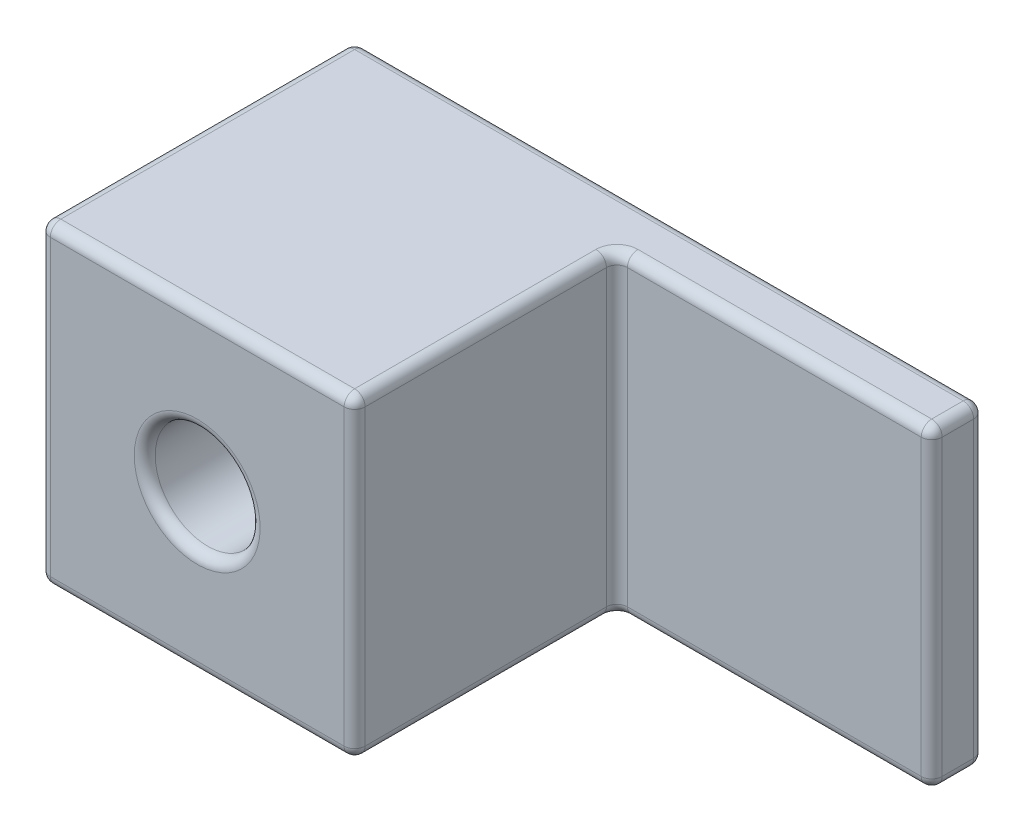
ISO-10303-21;
HEADER;
FILE_DESCRIPTION(('STEP AP214'),'2;1');
FILE_NAME('part.step','',(''),(''),'','','');
FILE_SCHEMA(('AUTOMOTIVE_DESIGN { 1 0 10303 214 1 1 1 1 }'));
ENDSEC;
DATA;
#1=APPLICATION_CONTEXT('core data for automotive mechanical design processes');
#2=APPLICATION_PROTOCOL_DEFINITION('international standard','automotive_design',2000,#1);
#3=PRODUCT_CONTEXT('',#1,'mechanical');
#4=PRODUCT('Part','Part','',(#3));
#5=PRODUCT_RELATED_PRODUCT_CATEGORY('part','',(#4));
#6=PRODUCT_DEFINITION_FORMATION('','',#4);
#7=PRODUCT_DEFINITION_CONTEXT('part definition',#1,'design');
#8=PRODUCT_DEFINITION('design','',#6,#7);
#9=PRODUCT_DEFINITION_SHAPE('','',#8);
#10=(LENGTH_UNIT() NAMED_UNIT(*) SI_UNIT(.MILLI.,.METRE.));
#11=(NAMED_UNIT(*) PLANE_ANGLE_UNIT() SI_UNIT($,.RADIAN.));
#12=(NAMED_UNIT(*) SI_UNIT($,.STERADIAN.) SOLID_ANGLE_UNIT());
#13=UNCERTAINTY_MEASURE_WITH_UNIT(LENGTH_MEASURE(1.E-05),#10,'distance_accuracy_value','');
#14=(GEOMETRIC_REPRESENTATION_CONTEXT(3) GLOBAL_UNCERTAINTY_ASSIGNED_CONTEXT((#13)) GLOBAL_UNIT_ASSIGNED_CONTEXT((#10,
#11,#12)) REPRESENTATION_CONTEXT('',''));
#15=CARTESIAN_POINT('',(0.,0.,0.));
#16=DIRECTION('',(0.,0.,1.));
#17=DIRECTION('',(1.,0.,0.));
#18=AXIS2_PLACEMENT_3D('',#15,#16,#17);
#19=CARTESIAN_POINT('',(60.,0.,60.));
#20=DIRECTION('',(-1.,0.,0.));
#21=DIRECTION('',(0.,0.,1.));
#22=AXIS2_PLACEMENT_3D('',#19,#20,#21);
#23=PLANE('',#22);
#24=DIRECTION('',(0.,1.,0.));
#25=VECTOR('',#24,1.);
#26=CARTESIAN_POINT('',(60.,0.,58.));
#27=LINE('',#26,#25);
#28=CARTESIAN_POINT('',(60.,58.,58.));
#29=VERTEX_POINT('',#28);
#30=CARTESIAN_POINT('',(60.,2.,58.));
#31=VERTEX_POINT('',#30);
#32=EDGE_CURVE('E46',#29,#31,#27,.F.);
#33=ORIENTED_EDGE('',*,*,#32,.T.);
#34=DIRECTION('',(0.,0.,-1.));
#35=VECTOR('',#34,1.);
#36=CARTESIAN_POINT('',(60.,2.,60.));
#37=LINE('',#36,#35);
#38=CARTESIAN_POINT('',(60.,2.,12.));
#39=VERTEX_POINT('',#38);
#40=EDGE_CURVE('E11',#31,#39,#37,.T.);
#41=ORIENTED_EDGE('',*,*,#40,.T.);
#42=DIRECTION('',(0.,-1.,0.));
#43=VECTOR('',#42,1.);
#44=CARTESIAN_POINT('',(60.,60.,12.));
#45=LINE('',#44,#43);
#46=CARTESIAN_POINT('',(60.,58.,12.));
#47=VERTEX_POINT('',#46);
#48=EDGE_CURVE('E289',#39,#47,#45,.F.);
#49=ORIENTED_EDGE('',*,*,#48,.T.);
#50=DIRECTION('',(0.,0.,-1.));
#51=VECTOR('',#50,1.);
#52=CARTESIAN_POINT('',(60.,58.,60.));
#53=LINE('',#52,#51);
#54=EDGE_CURVE('E57',#47,#29,#53,.F.);
#55=ORIENTED_EDGE('',*,*,#54,.T.);
#56=EDGE_LOOP('',(#33,#41,#49,#55));
#57=FACE_BOUND('',#56,.T.);
#58=ADVANCED_FACE('F37',(#57),#23,.F.);
#59=CARTESIAN_POINT('',(0.,0.,60.));
#60=DIRECTION('',(0.,0.,-1.));
#61=DIRECTION('',(-1.,0.,0.));
#62=AXIS2_PLACEMENT_3D('',#59,#60,#61);
#63=PLANE('',#62);
#64=CARTESIAN_POINT('',(30.,30.,60.));
#65=DIRECTION('',(0.,0.,-1.));
#66=DIRECTION('',(-1.,0.,0.));
#67=AXIS2_PLACEMENT_3D('',#64,#65,#66);
#68=CIRCLE('',#67,12.);
#69=CARTESIAN_POINT('',(18.,30.,60.));
#70=VERTEX_POINT('',#69);
#71=EDGE_CURVE('E239',#70,#70,#68,.T.);
#72=ORIENTED_EDGE('',*,*,#71,.T.);
#73=EDGE_LOOP('',(#72));
#74=FACE_BOUND('',#73,.T.);
#75=DIRECTION('',(-1.,0.,0.));
#76=VECTOR('',#75,1.);
#77=CARTESIAN_POINT('',(0.,58.,60.));
#78=LINE('',#77,#76);
#79=CARTESIAN_POINT('',(58.,58.,60.));
#80=VERTEX_POINT('',#79);
#81=CARTESIAN_POINT('',(2.,58.,60.));
#82=VERTEX_POINT('',#81);
#83=EDGE_CURVE('E232',#80,#82,#78,.T.);
#84=ORIENTED_EDGE('',*,*,#83,.T.);
#85=DIRECTION('',(0.,-1.,0.));
#86=VECTOR('',#85,1.);
#87=CARTESIAN_POINT('',(2.,0.,60.));
#88=LINE('',#87,#86);
#89=CARTESIAN_POINT('',(2.,2.,60.));
#90=VERTEX_POINT('',#89);
#91=EDGE_CURVE('E236',#82,#90,#88,.T.);
#92=ORIENTED_EDGE('',*,*,#91,.T.);
#93=DIRECTION('',(1.,0.,0.));
#94=VECTOR('',#93,1.);
#95=CARTESIAN_POINT('',(0.,2.,60.));
#96=LINE('',#95,#94);
#97=CARTESIAN_POINT('',(58.,2.,60.));
#98=VERTEX_POINT('',#97);
#99=EDGE_CURVE('E234',#90,#98,#96,.T.);
#100=ORIENTED_EDGE('',*,*,#99,.T.);
#101=DIRECTION('',(0.,1.,0.));
#102=VECTOR('',#101,1.);
#103=CARTESIAN_POINT('',(58.,0.,60.));
#104=LINE('',#103,#102);
#105=EDGE_CURVE('E230',#98,#80,#104,.T.);
#106=ORIENTED_EDGE('',*,*,#105,.T.);
#107=EDGE_LOOP('',(#84,#92,#100,#106));
#108=FACE_BOUND('',#107,.T.);
#109=ADVANCED_FACE('F401',(#74,#108),#63,.F.);
#110=CARTESIAN_POINT('',(0.,0.,0.));
#111=DIRECTION('',(0.,0.,-1.));
#112=DIRECTION('',(-1.,0.,0.));
#113=AXIS2_PLACEMENT_3D('',#110,#111,#112);
#114=PLANE('',#113);
#115=DIRECTION('',(0.,1.,0.));
#116=VECTOR('',#115,1.);
#117=CARTESIAN_POINT('',(118.,0.,0.));
#118=LINE('',#117,#116);
#119=CARTESIAN_POINT('',(118.,58.,0.));
#120=VERTEX_POINT('',#119);
#121=CARTESIAN_POINT('',(118.,2.,0.));
#122=VERTEX_POINT('',#121);
#123=EDGE_CURVE('E186',#120,#122,#118,.F.);
#124=ORIENTED_EDGE('',*,*,#123,.T.);
#125=DIRECTION('',(1.,0.,0.));
#126=VECTOR('',#125,1.);
#127=CARTESIAN_POINT('',(0.,2.,0.));
#128=LINE('',#127,#126);
#129=CARTESIAN_POINT('',(2.,2.,0.));
#130=VERTEX_POINT('',#129);
#131=EDGE_CURVE('E228',#122,#130,#128,.F.);
#132=ORIENTED_EDGE('',*,*,#131,.T.);
#133=DIRECTION('',(0.,-1.,0.));
#134=VECTOR('',#133,1.);
#135=CARTESIAN_POINT('',(2.,60.,0.));
#136=LINE('',#135,#134);
#137=CARTESIAN_POINT('',(2.,58.,0.));
#138=VERTEX_POINT('',#137);
#139=EDGE_CURVE('E225',#130,#138,#136,.F.);
#140=ORIENTED_EDGE('',*,*,#139,.T.);
#141=DIRECTION('',(-1.,0.,0.));
#142=VECTOR('',#141,1.);
#143=CARTESIAN_POINT('',(120.,58.,0.));
#144=LINE('',#143,#142);
#145=EDGE_CURVE('E223',#138,#120,#144,.F.);
#146=ORIENTED_EDGE('',*,*,#145,.T.);
#147=EDGE_LOOP('',(#124,#132,#140,#146));
#148=FACE_BOUND('',#147,.T.);
#149=CARTESIAN_POINT('',(30.,30.,0.));
#150=DIRECTION('',(0.,0.,-1.));
#151=DIRECTION('',(-1.,0.,0.));
#152=AXIS2_PLACEMENT_3D('',#149,#150,#151);
#153=CIRCLE('',#152,12.);
#154=CARTESIAN_POINT('',(18.,30.,0.));
#155=VERTEX_POINT('',#154);
#156=EDGE_CURVE('E220',#155,#155,#153,.F.);
#157=ORIENTED_EDGE('',*,*,#156,.T.);
#158=EDGE_LOOP('',(#157));
#159=FACE_BOUND('',#158,.T.);
#160=ADVANCED_FACE('F480',(#148,#159),#114,.T.);
#161=CARTESIAN_POINT('',(0.,0.,60.));
#162=DIRECTION('',(1.,0.,0.));
#163=DIRECTION('',(0.,0.,-1.));
#164=AXIS2_PLACEMENT_3D('',#161,#162,#163);
#165=PLANE('',#164);
#166=DIRECTION('',(0.,-1.,0.));
#167=VECTOR('',#166,1.);
#168=CARTESIAN_POINT('',(0.,0.,2.));
#169=LINE('',#168,#167);
#170=CARTESIAN_POINT('',(0.,58.,2.));
#171=VERTEX_POINT('',#170);
#172=CARTESIAN_POINT('',(0.,2.,2.));
#173=VERTEX_POINT('',#172);
#174=EDGE_CURVE('E244',#171,#173,#169,.T.);
#175=ORIENTED_EDGE('',*,*,#174,.T.);
#176=DIRECTION('',(0.,0.,-1.));
#177=VECTOR('',#176,1.);
#178=CARTESIAN_POINT('',(0.,2.,60.));
#179=LINE('',#178,#177);
#180=CARTESIAN_POINT('',(0.,2.,58.));
#181=VERTEX_POINT('',#180);
#182=EDGE_CURVE('E249',#173,#181,#179,.F.);
#183=ORIENTED_EDGE('',*,*,#182,.T.);
#184=DIRECTION('',(0.,-1.,0.));
#185=VECTOR('',#184,1.);
#186=CARTESIAN_POINT('',(0.,0.,58.));
#187=LINE('',#186,#185);
#188=CARTESIAN_POINT('',(0.,58.,58.));
#189=VERTEX_POINT('',#188);
#190=EDGE_CURVE('E246',#181,#189,#187,.F.);
#191=ORIENTED_EDGE('',*,*,#190,.T.);
#192=DIRECTION('',(0.,0.,-1.));
#193=VECTOR('',#192,1.);
#194=CARTESIAN_POINT('',(0.,58.,60.));
#195=LINE('',#194,#193);
#196=EDGE_CURVE('E242',#189,#171,#195,.T.);
#197=ORIENTED_EDGE('',*,*,#196,.T.);
#198=EDGE_LOOP('',(#175,#183,#191,#197));
#199=FACE_BOUND('',#198,.T.);
#200=ADVANCED_FACE('F427',(#199),#165,.F.);
#201=CARTESIAN_POINT('',(0.,0.,60.));
#202=DIRECTION('',(0.,1.,0.));
#203=DIRECTION('',(0.,0.,1.));
#204=AXIS2_PLACEMENT_3D('',#201,#202,#203);
#205=PLANE('',#204);
#206=DIRECTION('',(1.,0.,0.));
#207=VECTOR('',#206,1.);
#208=CARTESIAN_POINT('',(120.,0.,2.));
#209=LINE('',#208,#207);
#210=CARTESIAN_POINT('',(2.,0.,2.));
#211=VERTEX_POINT('',#210);
#212=CARTESIAN_POINT('',(118.,0.,2.));
#213=VERTEX_POINT('',#212);
#214=EDGE_CURVE('E263',#211,#213,#209,.T.);
#215=ORIENTED_EDGE('',*,*,#214,.T.);
#216=DIRECTION('',(0.,0.,-1.));
#217=VECTOR('',#216,1.);
#218=CARTESIAN_POINT('',(118.,0.,10.));
#219=LINE('',#218,#217);
#220=CARTESIAN_POINT('',(118.,0.,8.));
#221=VERTEX_POINT('',#220);
#222=EDGE_CURVE('E265',#213,#221,#219,.F.);
#223=ORIENTED_EDGE('',*,*,#222,.T.);
#224=DIRECTION('',(-1.,0.,0.));
#225=VECTOR('',#224,1.);
#226=CARTESIAN_POINT('',(0.,0.,8.));
#227=LINE('',#226,#225);
#228=CARTESIAN_POINT('',(62.,0.,8.));
#229=VERTEX_POINT('',#228);
#230=EDGE_CURVE('E256',#221,#229,#227,.T.);
#231=ORIENTED_EDGE('',*,*,#230,.T.);
#232=CARTESIAN_POINT('',(62.,0.,12.));
#233=DIRECTION('',(0.,1.,0.));
#234=DIRECTION('',(0.,0.,1.));
#235=AXIS2_PLACEMENT_3D('',#232,#233,#234);
#236=CIRCLE('',#235,4.);
#237=CARTESIAN_POINT('',(58.,0.,12.));
#238=VERTEX_POINT('',#237);
#239=EDGE_CURVE('E253',#238,#229,#236,.F.);
#240=ORIENTED_EDGE('',*,*,#239,.F.);
#241=DIRECTION('',(0.,0.,-1.));
#242=VECTOR('',#241,1.);
#243=CARTESIAN_POINT('',(58.,0.,60.));
#244=LINE('',#243,#242);
#245=CARTESIAN_POINT('',(58.,0.,58.));
#246=VERTEX_POINT('',#245);
#247=EDGE_CURVE('E251',#238,#246,#244,.F.);
#248=ORIENTED_EDGE('',*,*,#247,.T.);
#249=DIRECTION('',(1.,0.,0.));
#250=VECTOR('',#249,1.);
#251=CARTESIAN_POINT('',(0.,0.,58.));
#252=LINE('',#251,#250);
#253=CARTESIAN_POINT('',(2.,0.,58.));
#254=VERTEX_POINT('',#253);
#255=EDGE_CURVE('E258',#246,#254,#252,.F.);
#256=ORIENTED_EDGE('',*,*,#255,.T.);
#257=DIRECTION('',(0.,0.,-1.));
#258=VECTOR('',#257,1.);
#259=CARTESIAN_POINT('',(2.,0.,60.));
#260=LINE('',#259,#258);
#261=EDGE_CURVE('E260',#254,#211,#260,.T.);
#262=ORIENTED_EDGE('',*,*,#261,.T.);
#263=EDGE_LOOP('',(#215,#223,#231,#240,#248,#256,#262));
#264=FACE_BOUND('',#263,.T.);
#265=ADVANCED_FACE('F392',(#264),#205,.F.);
#266=CARTESIAN_POINT('',(0.,60.,60.));
#267=DIRECTION('',(0.,-1.,0.));
#268=DIRECTION('',(0.,0.,-1.));
#269=AXIS2_PLACEMENT_3D('',#266,#267,#268);
#270=PLANE('',#269);
#271=DIRECTION('',(-1.,0.,0.));
#272=VECTOR('',#271,1.);
#273=CARTESIAN_POINT('',(0.,60.,2.));
#274=LINE('',#273,#272);
#275=CARTESIAN_POINT('',(118.,60.,2.));
#276=VERTEX_POINT('',#275);
#277=CARTESIAN_POINT('',(2.,60.,2.));
#278=VERTEX_POINT('',#277);
#279=EDGE_CURVE('E279',#276,#278,#274,.T.);
#280=ORIENTED_EDGE('',*,*,#279,.T.);
#281=DIRECTION('',(0.,0.,-1.));
#282=VECTOR('',#281,1.);
#283=CARTESIAN_POINT('',(2.,60.,60.));
#284=LINE('',#283,#282);
#285=CARTESIAN_POINT('',(2.,60.,58.));
#286=VERTEX_POINT('',#285);
#287=EDGE_CURVE('E281',#278,#286,#284,.F.);
#288=ORIENTED_EDGE('',*,*,#287,.T.);
#289=DIRECTION('',(-1.,0.,0.));
#290=VECTOR('',#289,1.);
#291=CARTESIAN_POINT('',(0.,60.,58.));
#292=LINE('',#291,#290);
#293=CARTESIAN_POINT('',(58.,60.,58.));
#294=VERTEX_POINT('',#293);
#295=EDGE_CURVE('E272',#286,#294,#292,.F.);
#296=ORIENTED_EDGE('',*,*,#295,.T.);
#297=DIRECTION('',(0.,0.,-1.));
#298=VECTOR('',#297,1.);
#299=CARTESIAN_POINT('',(58.,60.,60.));
#300=LINE('',#299,#298);
#301=CARTESIAN_POINT('',(58.,60.,12.));
#302=VERTEX_POINT('',#301);
#303=EDGE_CURVE('E270',#294,#302,#300,.T.);
#304=ORIENTED_EDGE('',*,*,#303,.T.);
#305=CARTESIAN_POINT('',(62.,60.,12.));
#306=DIRECTION('',(0.,-1.,0.));
#307=DIRECTION('',(0.,0.,-1.));
#308=AXIS2_PLACEMENT_3D('',#305,#306,#307);
#309=CIRCLE('',#308,4.);
#310=CARTESIAN_POINT('',(62.,60.,8.));
#311=VERTEX_POINT('',#310);
#312=EDGE_CURVE('E267',#311,#302,#309,.F.);
#313=ORIENTED_EDGE('',*,*,#312,.F.);
#314=DIRECTION('',(-1.,0.,0.));
#315=VECTOR('',#314,1.);
#316=CARTESIAN_POINT('',(0.,60.,8.));
#317=LINE('',#316,#315);
#318=CARTESIAN_POINT('',(118.,60.,8.));
#319=VERTEX_POINT('',#318);
#320=EDGE_CURVE('E274',#311,#319,#317,.F.);
#321=ORIENTED_EDGE('',*,*,#320,.T.);
#322=DIRECTION('',(0.,0.,1.));
#323=VECTOR('',#322,1.);
#324=CARTESIAN_POINT('',(118.,60.,0.));
#325=LINE('',#324,#323);
#326=EDGE_CURVE('E276',#319,#276,#325,.F.);
#327=ORIENTED_EDGE('',*,*,#326,.T.);
#328=EDGE_LOOP('',(#280,#288,#296,#304,#313,#321,#327));
#329=FACE_BOUND('',#328,.T.);
#330=ADVANCED_FACE('F485',(#329),#270,.F.);
#331=CARTESIAN_POINT('',(30.,30.,60.));
#332=DIRECTION('',(0.,0.,-1.));
#333=DIRECTION('',(-1.,0.,0.));
#334=AXIS2_PLACEMENT_3D('',#331,#332,#333);
#335=CYLINDRICAL_SURFACE('',#334,10.);
#336=CARTESIAN_POINT('',(30.,30.,2.));
#337=DIRECTION('',(0.,0.,-1.));
#338=DIRECTION('',(-1.,0.,0.));
#339=AXIS2_PLACEMENT_3D('',#336,#337,#338);
#340=CIRCLE('',#339,10.);
#341=CARTESIAN_POINT('',(20.,30.,2.));
#342=VERTEX_POINT('',#341);
#343=EDGE_CURVE('E286',#342,#342,#340,.T.);
#344=ORIENTED_EDGE('',*,*,#343,.T.);
#345=EDGE_LOOP('',(#344));
#346=FACE_BOUND('',#345,.T.);
#347=CARTESIAN_POINT('',(30.,30.,58.));
#348=DIRECTION('',(0.,0.,-1.));
#349=DIRECTION('',(-1.,0.,0.));
#350=AXIS2_PLACEMENT_3D('',#347,#348,#349);
#351=CIRCLE('',#350,10.);
#352=CARTESIAN_POINT('',(20.,30.,58.));
#353=VERTEX_POINT('',#352);
#354=EDGE_CURVE('E283',#353,#353,#351,.F.);
#355=ORIENTED_EDGE('',*,*,#354,.T.);
#356=EDGE_LOOP('',(#355));
#357=FACE_BOUND('',#356,.T.);
#358=ADVANCED_FACE('F579',(#346,#357),#335,.F.);
#359=CARTESIAN_POINT('',(120.,0.,10.));
#360=DIRECTION('',(0.,0.,-1.));
#361=DIRECTION('',(-1.,0.,0.));
#362=AXIS2_PLACEMENT_3D('',#359,#360,#361);
#363=PLANE('',#362);
#364=DIRECTION('',(-1.,0.,0.));
#365=VECTOR('',#364,1.);
#366=CARTESIAN_POINT('',(120.,2.,10.));
#367=LINE('',#366,#365);
#368=CARTESIAN_POINT('',(62.,2.,10.));
#369=VERTEX_POINT('',#368);
#370=CARTESIAN_POINT('',(118.,2.,10.));
#371=VERTEX_POINT('',#370);
#372=EDGE_CURVE('E215',#369,#371,#367,.F.);
#373=ORIENTED_EDGE('',*,*,#372,.T.);
#374=DIRECTION('',(0.,-1.,0.));
#375=VECTOR('',#374,1.);
#376=CARTESIAN_POINT('',(118.,60.,10.));
#377=LINE('',#376,#375);
#378=CARTESIAN_POINT('',(118.,58.,10.));
#379=VERTEX_POINT('',#378);
#380=EDGE_CURVE('E217',#371,#379,#377,.F.);
#381=ORIENTED_EDGE('',*,*,#380,.T.);
#382=DIRECTION('',(-1.,0.,0.));
#383=VECTOR('',#382,1.);
#384=CARTESIAN_POINT('',(120.,58.,10.));
#385=LINE('',#384,#383);
#386=CARTESIAN_POINT('',(62.,58.,10.));
#387=VERTEX_POINT('',#386);
#388=EDGE_CURVE('E213',#379,#387,#385,.T.);
#389=ORIENTED_EDGE('',*,*,#388,.T.);
#390=DIRECTION('',(0.,-1.,0.));
#391=VECTOR('',#390,1.);
#392=CARTESIAN_POINT('',(62.,0.,10.));
#393=LINE('',#392,#391);
#394=EDGE_CURVE('E211',#387,#369,#393,.T.);
#395=ORIENTED_EDGE('',*,*,#394,.T.);
#396=EDGE_LOOP('',(#373,#381,#389,#395));
#397=FACE_BOUND('',#396,.T.);
#398=ADVANCED_FACE('F582',(#397),#363,.F.);
#399=CARTESIAN_POINT('',(120.,0.,0.));
#400=DIRECTION('',(1.,0.,0.));
#401=DIRECTION('',(0.,0.,-1.));
#402=AXIS2_PLACEMENT_3D('',#399,#400,#401);
#403=PLANE('',#402);
#404=DIRECTION('',(0.,-1.,0.));
#405=VECTOR('',#404,1.);
#406=CARTESIAN_POINT('',(120.,0.,8.));
#407=LINE('',#406,#405);
#408=CARTESIAN_POINT('',(120.,58.,8.));
#409=VERTEX_POINT('',#408);
#410=CARTESIAN_POINT('',(120.,2.,8.));
#411=VERTEX_POINT('',#410);
#412=EDGE_CURVE('E178',#409,#411,#407,.T.);
#413=ORIENTED_EDGE('',*,*,#412,.T.);
#414=DIRECTION('',(0.,0.,-1.));
#415=VECTOR('',#414,1.);
#416=CARTESIAN_POINT('',(120.,2.,0.));
#417=LINE('',#416,#415);
#418=CARTESIAN_POINT('',(120.,2.,2.));
#419=VERTEX_POINT('',#418);
#420=EDGE_CURVE('E174',#411,#419,#417,.T.);
#421=ORIENTED_EDGE('',*,*,#420,.T.);
#422=DIRECTION('',(0.,1.,0.));
#423=VECTOR('',#422,1.);
#424=CARTESIAN_POINT('',(120.,0.,2.));
#425=LINE('',#424,#423);
#426=CARTESIAN_POINT('',(120.,58.,2.));
#427=VERTEX_POINT('',#426);
#428=EDGE_CURVE('E166',#419,#427,#425,.T.);
#429=ORIENTED_EDGE('',*,*,#428,.T.);
#430=DIRECTION('',(0.,0.,1.));
#431=VECTOR('',#430,1.);
#432=CARTESIAN_POINT('',(120.,58.,10.));
#433=LINE('',#432,#431);
#434=EDGE_CURVE('E171',#427,#409,#433,.T.);
#435=ORIENTED_EDGE('',*,*,#434,.T.);
#436=EDGE_LOOP('',(#413,#421,#429,#435));
#437=FACE_BOUND('',#436,.T.);
#438=ADVANCED_FACE('F169',(#437),#403,.T.);
#439=CARTESIAN_POINT('',(2.,0.,58.));
#440=DIRECTION('',(0.,-1.,0.));
#441=DIRECTION('',(0.,0.,-1.));
#442=AXIS2_PLACEMENT_3D('',#439,#440,#441);
#443=CYLINDRICAL_SURFACE('',#442,2.);
#444=CARTESIAN_POINT('',(2.,58.,58.));
#445=DIRECTION('',(0.,1.,0.));
#446=DIRECTION('',(0.,0.,1.));
#447=AXIS2_PLACEMENT_3D('',#444,#445,#446);
#448=CIRCLE('',#447,2.);
#449=EDGE_CURVE('E41',#189,#82,#448,.T.);
#450=ORIENTED_EDGE('',*,*,#449,.F.);
#451=ORIENTED_EDGE('',*,*,#190,.F.);
#452=CARTESIAN_POINT('',(2.,2.,58.));
#453=DIRECTION('',(0.,-1.,0.));
#454=DIRECTION('',(0.,0.,-1.));
#455=AXIS2_PLACEMENT_3D('',#452,#453,#454);
#456=CIRCLE('',#455,2.);
#457=EDGE_CURVE('E207',#90,#181,#456,.T.);
#458=ORIENTED_EDGE('',*,*,#457,.F.);
#459=ORIENTED_EDGE('',*,*,#91,.F.);
#460=EDGE_LOOP('',(#450,#451,#458,#459));
#461=FACE_BOUND('',#460,.T.);
#462=ADVANCED_FACE('F417',(#461),#443,.T.);
#463=CARTESIAN_POINT('',(2.,58.,58.));
#464=DIRECTION('',(0.,0.,1.));
#465=DIRECTION('',(1.,0.,0.));
#466=AXIS2_PLACEMENT_3D('',#463,#464,#465);
#467=SPHERICAL_SURFACE('',#466,2.);
#468=CARTESIAN_POINT('',(2.,58.,58.));
#469=DIRECTION('',(0.,0.,1.));
#470=DIRECTION('',(1.,0.,0.));
#471=AXIS2_PLACEMENT_3D('',#468,#469,#470);
#472=CIRCLE('',#471,2.);
#473=EDGE_CURVE('E371',#189,#286,#472,.F.);
#474=ORIENTED_EDGE('',*,*,#473,.F.);
#475=ORIENTED_EDGE('',*,*,#449,.T.);
#476=CARTESIAN_POINT('',(2.,58.,58.));
#477=DIRECTION('',(-1.,0.,0.));
#478=DIRECTION('',(0.,0.,1.));
#479=AXIS2_PLACEMENT_3D('',#476,#477,#478);
#480=CIRCLE('',#479,2.);
#481=EDGE_CURVE('E374',#286,#82,#480,.F.);
#482=ORIENTED_EDGE('',*,*,#481,.F.);
#483=EDGE_LOOP('',(#474,#475,#482));
#484=FACE_BOUND('',#483,.T.);
#485=ADVANCED_FACE('F420',(#484),#467,.T.);
#486=CARTESIAN_POINT('',(2.,2.,58.));
#487=DIRECTION('',(-1.,0.,0.));
#488=DIRECTION('',(0.,0.,1.));
#489=AXIS2_PLACEMENT_3D('',#486,#487,#488);
#490=SPHERICAL_SURFACE('',#489,2.);
#491=CARTESIAN_POINT('',(2.,2.,58.));
#492=DIRECTION('',(-1.,0.,0.));
#493=DIRECTION('',(0.,0.,1.));
#494=AXIS2_PLACEMENT_3D('',#491,#492,#493);
#495=CIRCLE('',#494,2.);
#496=EDGE_CURVE('E365',#90,#254,#495,.F.);
#497=ORIENTED_EDGE('',*,*,#496,.F.);
#498=ORIENTED_EDGE('',*,*,#457,.T.);
#499=CARTESIAN_POINT('',(2.,2.,58.));
#500=DIRECTION('',(0.,0.,1.));
#501=DIRECTION('',(1.,0.,0.));
#502=AXIS2_PLACEMENT_3D('',#499,#500,#501);
#503=CIRCLE('',#502,2.);
#504=EDGE_CURVE('E368',#254,#181,#503,.F.);
#505=ORIENTED_EDGE('',*,*,#504,.F.);
#506=EDGE_LOOP('',(#497,#498,#505));
#507=FACE_BOUND('',#506,.T.);
#508=ADVANCED_FACE('F381',(#507),#490,.T.);
#509=CARTESIAN_POINT('',(0.,58.,58.));
#510=DIRECTION('',(-1.,0.,0.));
#511=DIRECTION('',(0.,0.,1.));
#512=AXIS2_PLACEMENT_3D('',#509,#510,#511);
#513=CYLINDRICAL_SURFACE('',#512,2.);
#514=ORIENTED_EDGE('',*,*,#481,.T.);
#515=ORIENTED_EDGE('',*,*,#83,.F.);
#516=CARTESIAN_POINT('',(58.,58.,58.));
#517=DIRECTION('',(1.,0.,0.));
#518=DIRECTION('',(0.,0.,-1.));
#519=AXIS2_PLACEMENT_3D('',#516,#517,#518);
#520=CIRCLE('',#519,2.);
#521=EDGE_CURVE('E359',#294,#80,#520,.T.);
#522=ORIENTED_EDGE('',*,*,#521,.F.);
#523=ORIENTED_EDGE('',*,*,#295,.F.);
#524=EDGE_LOOP('',(#514,#515,#522,#523));
#525=FACE_BOUND('',#524,.T.);
#526=ADVANCED_FACE('F414',(#525),#513,.T.);
#527=CARTESIAN_POINT('',(2.,58.,60.));
#528=DIRECTION('',(0.,0.,-1.));
#529=DIRECTION('',(-1.,0.,0.));
#530=AXIS2_PLACEMENT_3D('',#527,#528,#529);
#531=CYLINDRICAL_SURFACE('',#530,2.);
#532=ORIENTED_EDGE('',*,*,#473,.T.);
#533=ORIENTED_EDGE('',*,*,#287,.F.);
#534=CARTESIAN_POINT('',(2.,58.,2.));
#535=DIRECTION('',(0.,0.,-1.));
#536=DIRECTION('',(-1.,0.,0.));
#537=AXIS2_PLACEMENT_3D('',#534,#535,#536);
#538=CIRCLE('',#537,2.);
#539=EDGE_CURVE('E356',#171,#278,#538,.T.);
#540=ORIENTED_EDGE('',*,*,#539,.F.);
#541=ORIENTED_EDGE('',*,*,#196,.F.);
#542=EDGE_LOOP('',(#532,#533,#540,#541));
#543=FACE_BOUND('',#542,.T.);
#544=ADVANCED_FACE('F423',(#543),#531,.T.);
#545=CARTESIAN_POINT('',(2.,0.,2.));
#546=DIRECTION('',(0.,1.,0.));
#547=DIRECTION('',(0.,0.,1.));
#548=AXIS2_PLACEMENT_3D('',#545,#546,#547);
#549=CYLINDRICAL_SURFACE('',#548,2.);
#550=CARTESIAN_POINT('',(2.,2.,2.));
#551=DIRECTION('',(0.,-1.,0.));
#552=DIRECTION('',(0.,0.,-1.));
#553=AXIS2_PLACEMENT_3D('',#550,#551,#552);
#554=CIRCLE('',#553,2.);
#555=EDGE_CURVE('E350',#173,#130,#554,.T.);
#556=ORIENTED_EDGE('',*,*,#555,.F.);
#557=ORIENTED_EDGE('',*,*,#174,.F.);
#558=CARTESIAN_POINT('',(2.,58.,2.));
#559=DIRECTION('',(0.,1.,0.));
#560=DIRECTION('',(0.,0.,1.));
#561=AXIS2_PLACEMENT_3D('',#558,#559,#560);
#562=CIRCLE('',#561,2.);
#563=EDGE_CURVE('E353',#138,#171,#562,.T.);
#564=ORIENTED_EDGE('',*,*,#563,.F.);
#565=ORIENTED_EDGE('',*,*,#139,.F.);
#566=EDGE_LOOP('',(#556,#557,#564,#565));
#567=FACE_BOUND('',#566,.T.);
#568=ADVANCED_FACE('F430',(#567),#549,.T.);
#569=CARTESIAN_POINT('',(2.,2.,60.));
#570=DIRECTION('',(0.,0.,-1.));
#571=DIRECTION('',(-1.,0.,0.));
#572=AXIS2_PLACEMENT_3D('',#569,#570,#571);
#573=CYLINDRICAL_SURFACE('',#572,2.);
#574=ORIENTED_EDGE('',*,*,#504,.T.);
#575=ORIENTED_EDGE('',*,*,#182,.F.);
#576=CARTESIAN_POINT('',(2.,2.,2.));
#577=DIRECTION('',(0.,0.,-1.));
#578=DIRECTION('',(-1.,0.,0.));
#579=AXIS2_PLACEMENT_3D('',#576,#577,#578);
#580=CIRCLE('',#579,2.);
#581=EDGE_CURVE('E347',#211,#173,#580,.T.);
#582=ORIENTED_EDGE('',*,*,#581,.F.);
#583=ORIENTED_EDGE('',*,*,#261,.F.);
#584=EDGE_LOOP('',(#574,#575,#582,#583));
#585=FACE_BOUND('',#584,.T.);
#586=ADVANCED_FACE('F388',(#585),#573,.T.);
#587=CARTESIAN_POINT('',(0.,2.,58.));
#588=DIRECTION('',(1.,0.,0.));
#589=DIRECTION('',(0.,0.,-1.));
#590=AXIS2_PLACEMENT_3D('',#587,#588,#589);
#591=CYLINDRICAL_SURFACE('',#590,2.);
#592=ORIENTED_EDGE('',*,*,#496,.T.);
#593=ORIENTED_EDGE('',*,*,#255,.F.);
#594=CARTESIAN_POINT('',(58.,2.,58.));
#595=DIRECTION('',(1.,0.,0.));
#596=DIRECTION('',(0.,0.,-1.));
#597=AXIS2_PLACEMENT_3D('',#594,#595,#596);
#598=CIRCLE('',#597,2.);
#599=EDGE_CURVE('E344',#98,#246,#598,.T.);
#600=ORIENTED_EDGE('',*,*,#599,.F.);
#601=ORIENTED_EDGE('',*,*,#99,.F.);
#602=EDGE_LOOP('',(#592,#593,#600,#601));
#603=FACE_BOUND('',#602,.T.);
#604=ADVANCED_FACE('F398',(#603),#591,.T.);
#605=CARTESIAN_POINT('',(58.,0.,58.));
#606=DIRECTION('',(0.,1.,0.));
#607=DIRECTION('',(0.,0.,1.));
#608=AXIS2_PLACEMENT_3D('',#605,#606,#607);
#609=CYLINDRICAL_SURFACE('',#608,2.);
#610=CARTESIAN_POINT('',(58.,58.,58.));
#611=DIRECTION('',(0.,1.,0.));
#612=DIRECTION('',(0.,0.,1.));
#613=AXIS2_PLACEMENT_3D('',#610,#611,#612);
#614=CIRCLE('',#613,2.);
#615=EDGE_CURVE('E362',#80,#29,#614,.T.);
#616=ORIENTED_EDGE('',*,*,#615,.F.);
#617=ORIENTED_EDGE('',*,*,#105,.F.);
#618=CARTESIAN_POINT('',(58.,2.,58.));
#619=DIRECTION('',(0.,-1.,0.));
#620=DIRECTION('',(0.,0.,-1.));
#621=AXIS2_PLACEMENT_3D('',#618,#619,#620);
#622=CIRCLE('',#621,2.);
#623=EDGE_CURVE('E341',#31,#98,#622,.T.);
#624=ORIENTED_EDGE('',*,*,#623,.F.);
#625=ORIENTED_EDGE('',*,*,#32,.F.);
#626=EDGE_LOOP('',(#616,#617,#624,#625));
#627=FACE_BOUND('',#626,.T.);
#628=ADVANCED_FACE('F405',(#627),#609,.T.);
#629=CARTESIAN_POINT('',(58.,58.,58.));
#630=DIRECTION('',(0.,0.,1.));
#631=DIRECTION('',(1.,0.,0.));
#632=AXIS2_PLACEMENT_3D('',#629,#630,#631);
#633=SPHERICAL_SURFACE('',#632,2.);
#634=ORIENTED_EDGE('',*,*,#521,.T.);
#635=ORIENTED_EDGE('',*,*,#615,.T.);
#636=CARTESIAN_POINT('',(58.,58.,58.));
#637=DIRECTION('',(0.,0.,1.));
#638=DIRECTION('',(1.,0.,0.));
#639=AXIS2_PLACEMENT_3D('',#636,#637,#638);
#640=CIRCLE('',#639,2.);
#641=EDGE_CURVE('E338',#294,#29,#640,.F.);
#642=ORIENTED_EDGE('',*,*,#641,.F.);
#643=EDGE_LOOP('',(#634,#635,#642));
#644=FACE_BOUND('',#643,.T.);
#645=ADVANCED_FACE('F410',(#644),#633,.T.);
#646=CARTESIAN_POINT('',(2.,58.,2.));
#647=DIRECTION('',(-1.,0.,0.));
#648=DIRECTION('',(0.,0.,1.));
#649=AXIS2_PLACEMENT_3D('',#646,#647,#648);
#650=SPHERICAL_SURFACE('',#649,2.);
#651=ORIENTED_EDGE('',*,*,#563,.T.);
#652=ORIENTED_EDGE('',*,*,#539,.T.);
#653=CARTESIAN_POINT('',(2.,58.,2.));
#654=DIRECTION('',(-1.,0.,0.));
#655=DIRECTION('',(0.,0.,1.));
#656=AXIS2_PLACEMENT_3D('',#653,#654,#655);
#657=CIRCLE('',#656,2.);
#658=EDGE_CURVE('E335',#138,#278,#657,.F.);
#659=ORIENTED_EDGE('',*,*,#658,.F.);
#660=EDGE_LOOP('',(#651,#652,#659));
#661=FACE_BOUND('',#660,.T.);
#662=ADVANCED_FACE('F473',(#661),#650,.T.);
#663=CARTESIAN_POINT('',(2.,2.,2.));
#664=DIRECTION('',(-1.,0.,0.));
#665=DIRECTION('',(0.,0.,1.));
#666=AXIS2_PLACEMENT_3D('',#663,#664,#665);
#667=SPHERICAL_SURFACE('',#666,2.);
#668=ORIENTED_EDGE('',*,*,#581,.T.);
#669=ORIENTED_EDGE('',*,*,#555,.T.);
#670=CARTESIAN_POINT('',(2.,2.,2.));
#671=DIRECTION('',(-1.,0.,0.));
#672=DIRECTION('',(0.,0.,1.));
#673=AXIS2_PLACEMENT_3D('',#670,#671,#672);
#674=CIRCLE('',#673,2.);
#675=EDGE_CURVE('E332',#211,#130,#674,.F.);
#676=ORIENTED_EDGE('',*,*,#675,.F.);
#677=EDGE_LOOP('',(#668,#669,#676));
#678=FACE_BOUND('',#677,.T.);
#679=ADVANCED_FACE('F435',(#678),#667,.T.);
#680=CARTESIAN_POINT('',(58.,2.,58.));
#681=DIRECTION('',(0.,0.,1.));
#682=DIRECTION('',(1.,0.,0.));
#683=AXIS2_PLACEMENT_3D('',#680,#681,#682);
#684=SPHERICAL_SURFACE('',#683,2.);
#685=ORIENTED_EDGE('',*,*,#623,.T.);
#686=ORIENTED_EDGE('',*,*,#599,.T.);
#687=CARTESIAN_POINT('',(58.,2.,58.));
#688=DIRECTION('',(0.,0.,1.));
#689=DIRECTION('',(1.,0.,0.));
#690=AXIS2_PLACEMENT_3D('',#687,#688,#689);
#691=CIRCLE('',#690,2.);
#692=EDGE_CURVE('E329',#31,#246,#691,.F.);
#693=ORIENTED_EDGE('',*,*,#692,.F.);
#694=EDGE_LOOP('',(#685,#686,#693));
#695=FACE_BOUND('',#694,.T.);
#696=ADVANCED_FACE('F462',(#695),#684,.T.);
#697=CARTESIAN_POINT('',(58.,58.,60.));
#698=DIRECTION('',(0.,0.,-1.));
#699=DIRECTION('',(-1.,0.,0.));
#700=AXIS2_PLACEMENT_3D('',#697,#698,#699);
#701=CYLINDRICAL_SURFACE('',#700,2.);
#702=ORIENTED_EDGE('',*,*,#641,.T.);
#703=ORIENTED_EDGE('',*,*,#54,.F.);
#704=CARTESIAN_POINT('',(58.,58.,12.));
#705=DIRECTION('',(0.,0.,-1.));
#706=DIRECTION('',(-1.,0.,0.));
#707=AXIS2_PLACEMENT_3D('',#704,#705,#706);
#708=CIRCLE('',#707,2.);
#709=EDGE_CURVE('E323',#302,#47,#708,.T.);
#710=ORIENTED_EDGE('',*,*,#709,.F.);
#711=ORIENTED_EDGE('',*,*,#303,.F.);
#712=EDGE_LOOP('',(#702,#703,#710,#711));
#713=FACE_BOUND('',#712,.T.);
#714=ADVANCED_FACE('F464',(#713),#701,.T.);
#715=CARTESIAN_POINT('',(0.,58.,2.));
#716=DIRECTION('',(1.,0.,0.));
#717=DIRECTION('',(0.,0.,-1.));
#718=AXIS2_PLACEMENT_3D('',#715,#716,#717);
#719=CYLINDRICAL_SURFACE('',#718,2.);
#720=ORIENTED_EDGE('',*,*,#658,.T.);
#721=ORIENTED_EDGE('',*,*,#279,.F.);
#722=CARTESIAN_POINT('',(118.,58.,2.));
#723=DIRECTION('',(1.,0.,0.));
#724=DIRECTION('',(0.,0.,-1.));
#725=AXIS2_PLACEMENT_3D('',#722,#723,#724);
#726=CIRCLE('',#725,2.);
#727=EDGE_CURVE('E190',#120,#276,#726,.T.);
#728=ORIENTED_EDGE('',*,*,#727,.F.);
#729=ORIENTED_EDGE('',*,*,#145,.F.);
#730=EDGE_LOOP('',(#720,#721,#728,#729));
#731=FACE_BOUND('',#730,.T.);
#732=ADVANCED_FACE('F470',(#731),#719,.T.);
#733=CARTESIAN_POINT('',(118.,0.,2.));
#734=DIRECTION('',(0.,1.,0.));
#735=DIRECTION('',(0.,0.,1.));
#736=AXIS2_PLACEMENT_3D('',#733,#734,#735);
#737=CYLINDRICAL_SURFACE('',#736,2.);
#738=CARTESIAN_POINT('',(118.,2.,2.));
#739=DIRECTION('',(0.,-1.,0.));
#740=DIRECTION('',(0.,0.,-1.));
#741=AXIS2_PLACEMENT_3D('',#738,#739,#740);
#742=CIRCLE('',#741,2.);
#743=EDGE_CURVE('E191',#122,#419,#742,.T.);
#744=ORIENTED_EDGE('',*,*,#743,.F.);
#745=ORIENTED_EDGE('',*,*,#123,.F.);
#746=CARTESIAN_POINT('',(118.,58.,2.));
#747=DIRECTION('',(0.,1.,0.));
#748=DIRECTION('',(0.,0.,1.));
#749=AXIS2_PLACEMENT_3D('',#746,#747,#748);
#750=CIRCLE('',#749,2.);
#751=EDGE_CURVE('E182',#427,#120,#750,.T.);
#752=ORIENTED_EDGE('',*,*,#751,.F.);
#753=ORIENTED_EDGE('',*,*,#428,.F.);
#754=EDGE_LOOP('',(#744,#745,#752,#753));
#755=FACE_BOUND('',#754,.T.);
#756=ADVANCED_FACE('F184',(#755),#737,.T.);
#757=CARTESIAN_POINT('',(0.,2.,2.));
#758=DIRECTION('',(-1.,0.,0.));
#759=DIRECTION('',(0.,0.,1.));
#760=AXIS2_PLACEMENT_3D('',#757,#758,#759);
#761=CYLINDRICAL_SURFACE('',#760,2.);
#762=ORIENTED_EDGE('',*,*,#675,.T.);
#763=ORIENTED_EDGE('',*,*,#131,.F.);
#764=CARTESIAN_POINT('',(118.,2.,2.));
#765=DIRECTION('',(1.,0.,0.));
#766=DIRECTION('',(0.,0.,-1.));
#767=AXIS2_PLACEMENT_3D('',#764,#765,#766);
#768=CIRCLE('',#767,2.);
#769=EDGE_CURVE('E319',#213,#122,#768,.T.);
#770=ORIENTED_EDGE('',*,*,#769,.F.);
#771=ORIENTED_EDGE('',*,*,#214,.F.);
#772=EDGE_LOOP('',(#762,#763,#770,#771));
#773=FACE_BOUND('',#772,.T.);
#774=ADVANCED_FACE('F438',(#773),#761,.T.);
#775=CARTESIAN_POINT('',(58.,2.,60.));
#776=DIRECTION('',(0.,0.,-1.));
#777=DIRECTION('',(-1.,0.,0.));
#778=AXIS2_PLACEMENT_3D('',#775,#776,#777);
#779=CYLINDRICAL_SURFACE('',#778,2.);
#780=ORIENTED_EDGE('',*,*,#692,.T.);
#781=ORIENTED_EDGE('',*,*,#247,.F.);
#782=CARTESIAN_POINT('',(58.,2.,12.));
#783=DIRECTION('',(0.,0.,-1.));
#784=DIRECTION('',(-1.,0.,0.));
#785=AXIS2_PLACEMENT_3D('',#782,#783,#784);
#786=CIRCLE('',#785,2.);
#787=EDGE_CURVE('E316',#39,#238,#786,.T.);
#788=ORIENTED_EDGE('',*,*,#787,.F.);
#789=ORIENTED_EDGE('',*,*,#40,.F.);
#790=EDGE_LOOP('',(#780,#781,#788,#789));
#791=FACE_BOUND('',#790,.T.);
#792=ADVANCED_FACE('F458',(#791),#779,.T.);
#793=CARTESIAN_POINT('',(62.,0.,12.));
#794=DIRECTION('',(0.,1.,0.));
#795=DIRECTION('',(0.,0.,1.));
#796=AXIS2_PLACEMENT_3D('',#793,#794,#795);
#797=CYLINDRICAL_SURFACE('',#796,2.);
#798=CARTESIAN_POINT('',(62.,58.,12.));
#799=DIRECTION('',(0.,-1.,0.));
#800=DIRECTION('',(0.,0.,-1.));
#801=AXIS2_PLACEMENT_3D('',#798,#799,#800);
#802=CIRCLE('',#801,2.);
#803=EDGE_CURVE('E326',#47,#387,#802,.T.);
#804=ORIENTED_EDGE('',*,*,#803,.F.);
#805=ORIENTED_EDGE('',*,*,#48,.F.);
#806=CARTESIAN_POINT('',(62.,2.,12.));
#807=DIRECTION('',(0.,1.,0.));
#808=DIRECTION('',(0.,0.,1.));
#809=AXIS2_PLACEMENT_3D('',#806,#807,#808);
#810=CIRCLE('',#809,2.);
#811=EDGE_CURVE('E314',#369,#39,#810,.T.);
#812=ORIENTED_EDGE('',*,*,#811,.F.);
#813=ORIENTED_EDGE('',*,*,#394,.F.);
#814=EDGE_LOOP('',(#804,#805,#812,#813));
#815=FACE_BOUND('',#814,.T.);
#816=ADVANCED_FACE('F523',(#815),#797,.F.);
#817=CARTESIAN_POINT('',(62.,58.,12.));
#818=DIRECTION('',(0.,-1.,0.));
#819=DIRECTION('',(0.,0.,-1.));
#820=AXIS2_PLACEMENT_3D('',#817,#818,#819);
#821=TOROIDAL_SURFACE('',#820,4.,2.);
#822=ORIENTED_EDGE('',*,*,#709,.T.);
#823=ORIENTED_EDGE('',*,*,#803,.T.);
#824=CARTESIAN_POINT('',(62.,58.,8.));
#825=DIRECTION('',(-1.,0.,0.));
#826=DIRECTION('',(0.,0.,1.));
#827=AXIS2_PLACEMENT_3D('',#824,#825,#826);
#828=CIRCLE('',#827,2.);
#829=EDGE_CURVE('E198',#311,#387,#828,.F.);
#830=ORIENTED_EDGE('',*,*,#829,.F.);
#831=ORIENTED_EDGE('',*,*,#312,.T.);
#832=EDGE_LOOP('',(#822,#823,#830,#831));
#833=FACE_BOUND('',#832,.T.);
#834=ADVANCED_FACE('F520',(#833),#821,.T.);
#835=CARTESIAN_POINT('',(118.,58.,2.));
#836=DIRECTION('',(0.,0.,-1.));
#837=DIRECTION('',(-1.,0.,0.));
#838=AXIS2_PLACEMENT_3D('',#835,#836,#837);
#839=SPHERICAL_SURFACE('',#838,2.);
#840=ORIENTED_EDGE('',*,*,#751,.T.);
#841=ORIENTED_EDGE('',*,*,#727,.T.);
#842=CARTESIAN_POINT('',(118.,58.,2.));
#843=DIRECTION('',(0.,0.,-1.));
#844=DIRECTION('',(-1.,0.,0.));
#845=AXIS2_PLACEMENT_3D('',#842,#843,#844);
#846=CIRCLE('',#845,2.);
#847=EDGE_CURVE('E193',#427,#276,#846,.F.);
#848=ORIENTED_EDGE('',*,*,#847,.F.);
#849=EDGE_LOOP('',(#840,#841,#848));
#850=FACE_BOUND('',#849,.T.);
#851=ADVANCED_FACE('F194',(#850),#839,.T.);
#852=CARTESIAN_POINT('',(118.,2.,2.));
#853=DIRECTION('',(0.,0.,-1.));
#854=DIRECTION('',(-1.,0.,0.));
#855=AXIS2_PLACEMENT_3D('',#852,#853,#854);
#856=SPHERICAL_SURFACE('',#855,2.);
#857=ORIENTED_EDGE('',*,*,#769,.T.);
#858=ORIENTED_EDGE('',*,*,#743,.T.);
#859=CARTESIAN_POINT('',(118.,2.,2.));
#860=DIRECTION('',(0.,0.,-1.));
#861=DIRECTION('',(0.,1.,0.));
#862=AXIS2_PLACEMENT_3D('',#859,#860,#861);
#863=CIRCLE('',#862,2.);
#864=EDGE_CURVE('E199',#213,#419,#863,.F.);
#865=ORIENTED_EDGE('',*,*,#864,.F.);
#866=EDGE_LOOP('',(#857,#858,#865));
#867=FACE_BOUND('',#866,.T.);
#868=ADVANCED_FACE('F442',(#867),#856,.T.);
#869=CARTESIAN_POINT('',(62.,2.,12.));
#870=DIRECTION('',(0.,1.,0.));
#871=DIRECTION('',(0.,0.,1.));
#872=AXIS2_PLACEMENT_3D('',#869,#870,#871);
#873=TOROIDAL_SURFACE('',#872,4.,2.);
#874=ORIENTED_EDGE('',*,*,#787,.T.);
#875=ORIENTED_EDGE('',*,*,#239,.T.);
#876=CARTESIAN_POINT('',(62.,2.,8.));
#877=DIRECTION('',(-1.,0.,0.));
#878=DIRECTION('',(0.,0.,1.));
#879=AXIS2_PLACEMENT_3D('',#876,#877,#878);
#880=CIRCLE('',#879,2.);
#881=EDGE_CURVE('E307',#369,#229,#880,.F.);
#882=ORIENTED_EDGE('',*,*,#881,.F.);
#883=ORIENTED_EDGE('',*,*,#811,.T.);
#884=EDGE_LOOP('',(#874,#875,#882,#883));
#885=FACE_BOUND('',#884,.T.);
#886=ADVANCED_FACE('F454',(#885),#873,.T.);
#887=CARTESIAN_POINT('',(120.,58.,8.));
#888=DIRECTION('',(-1.,0.,0.));
#889=DIRECTION('',(0.,0.,1.));
#890=AXIS2_PLACEMENT_3D('',#887,#888,#889);
#891=CYLINDRICAL_SURFACE('',#890,2.);
#892=ORIENTED_EDGE('',*,*,#829,.T.);
#893=ORIENTED_EDGE('',*,*,#388,.F.);
#894=CARTESIAN_POINT('',(118.,58.,8.));
#895=DIRECTION('',(1.,0.,0.));
#896=DIRECTION('',(0.,0.,-1.));
#897=AXIS2_PLACEMENT_3D('',#894,#895,#896);
#898=CIRCLE('',#897,2.);
#899=EDGE_CURVE('E304',#319,#379,#898,.T.);
#900=ORIENTED_EDGE('',*,*,#899,.F.);
#901=ORIENTED_EDGE('',*,*,#320,.F.);
#902=EDGE_LOOP('',(#892,#893,#900,#901));
#903=FACE_BOUND('',#902,.T.);
#904=ADVANCED_FACE('F510',(#903),#891,.T.);
#905=CARTESIAN_POINT('',(118.,58.,0.));
#906=DIRECTION('',(0.,0.,-1.));
#907=DIRECTION('',(-1.,0.,0.));
#908=AXIS2_PLACEMENT_3D('',#905,#906,#907);
#909=CYLINDRICAL_SURFACE('',#908,2.);
#910=ORIENTED_EDGE('',*,*,#847,.T.);
#911=ORIENTED_EDGE('',*,*,#326,.F.);
#912=CARTESIAN_POINT('',(118.,58.,8.));
#913=DIRECTION('',(0.,0.,1.));
#914=DIRECTION('',(1.,0.,0.));
#915=AXIS2_PLACEMENT_3D('',#912,#913,#914);
#916=CIRCLE('',#915,2.);
#917=EDGE_CURVE('E203',#409,#319,#916,.T.);
#918=ORIENTED_EDGE('',*,*,#917,.F.);
#919=ORIENTED_EDGE('',*,*,#434,.F.);
#920=EDGE_LOOP('',(#910,#911,#918,#919));
#921=FACE_BOUND('',#920,.T.);
#922=ADVANCED_FACE('F201',(#921),#909,.T.);
#923=CARTESIAN_POINT('',(118.,2.,0.));
#924=DIRECTION('',(0.,0.,1.));
#925=DIRECTION('',(1.,0.,0.));
#926=AXIS2_PLACEMENT_3D('',#923,#924,#925);
#927=CYLINDRICAL_SURFACE('',#926,2.);
#928=ORIENTED_EDGE('',*,*,#864,.T.);
#929=ORIENTED_EDGE('',*,*,#420,.F.);
#930=CARTESIAN_POINT('',(118.,2.,8.));
#931=DIRECTION('',(0.,0.,1.));
#932=DIRECTION('',(1.,0.,0.));
#933=AXIS2_PLACEMENT_3D('',#930,#931,#932);
#934=CIRCLE('',#933,2.);
#935=EDGE_CURVE('E300',#221,#411,#934,.T.);
#936=ORIENTED_EDGE('',*,*,#935,.F.);
#937=ORIENTED_EDGE('',*,*,#222,.F.);
#938=EDGE_LOOP('',(#928,#929,#936,#937));
#939=FACE_BOUND('',#938,.T.);
#940=ADVANCED_FACE('F445',(#939),#927,.T.);
#941=CARTESIAN_POINT('',(0.,2.,8.));
#942=DIRECTION('',(-1.,0.,0.));
#943=DIRECTION('',(0.,0.,1.));
#944=AXIS2_PLACEMENT_3D('',#941,#942,#943);
#945=CYLINDRICAL_SURFACE('',#944,2.);
#946=ORIENTED_EDGE('',*,*,#881,.T.);
#947=ORIENTED_EDGE('',*,*,#230,.F.);
#948=CARTESIAN_POINT('',(118.,2.,8.));
#949=DIRECTION('',(1.,0.,0.));
#950=DIRECTION('',(0.,0.,-1.));
#951=AXIS2_PLACEMENT_3D('',#948,#949,#950);
#952=CIRCLE('',#951,2.);
#953=EDGE_CURVE('E297',#371,#221,#952,.T.);
#954=ORIENTED_EDGE('',*,*,#953,.F.);
#955=ORIENTED_EDGE('',*,*,#372,.F.);
#956=EDGE_LOOP('',(#946,#947,#954,#955));
#957=FACE_BOUND('',#956,.T.);
#958=ADVANCED_FACE('F449',(#957),#945,.T.);
#959=CARTESIAN_POINT('',(118.,58.,8.));
#960=DIRECTION('',(0.,1.,0.));
#961=DIRECTION('',(0.,0.,1.));
#962=AXIS2_PLACEMENT_3D('',#959,#960,#961);
#963=SPHERICAL_SURFACE('',#962,2.);
#964=ORIENTED_EDGE('',*,*,#917,.T.);
#965=ORIENTED_EDGE('',*,*,#899,.T.);
#966=CARTESIAN_POINT('',(118.,58.,8.));
#967=DIRECTION('',(0.,1.,0.));
#968=DIRECTION('',(0.,0.,1.));
#969=AXIS2_PLACEMENT_3D('',#966,#967,#968);
#970=CIRCLE('',#969,2.);
#971=EDGE_CURVE('E295',#409,#379,#970,.F.);
#972=ORIENTED_EDGE('',*,*,#971,.F.);
#973=EDGE_LOOP('',(#964,#965,#972));
#974=FACE_BOUND('',#973,.T.);
#975=ADVANCED_FACE('F499',(#974),#963,.T.);
#976=CARTESIAN_POINT('',(118.,2.,8.));
#977=DIRECTION('',(0.,-1.,0.));
#978=DIRECTION('',(0.,0.,-1.));
#979=AXIS2_PLACEMENT_3D('',#976,#977,#978);
#980=SPHERICAL_SURFACE('',#979,2.);
#981=ORIENTED_EDGE('',*,*,#953,.T.);
#982=ORIENTED_EDGE('',*,*,#935,.T.);
#983=CARTESIAN_POINT('',(118.,2.,8.));
#984=DIRECTION('',(0.,-1.,0.));
#985=DIRECTION('',(0.,0.,-1.));
#986=AXIS2_PLACEMENT_3D('',#983,#984,#985);
#987=CIRCLE('',#986,2.);
#988=EDGE_CURVE('E293',#371,#411,#987,.F.);
#989=ORIENTED_EDGE('',*,*,#988,.F.);
#990=EDGE_LOOP('',(#981,#982,#989));
#991=FACE_BOUND('',#990,.T.);
#992=ADVANCED_FACE('F495',(#991),#980,.T.);
#993=CARTESIAN_POINT('',(118.,0.,8.));
#994=DIRECTION('',(0.,1.,0.));
#995=DIRECTION('',(0.,0.,1.));
#996=AXIS2_PLACEMENT_3D('',#993,#994,#995);
#997=CYLINDRICAL_SURFACE('',#996,2.);
#998=ORIENTED_EDGE('',*,*,#971,.T.);
#999=ORIENTED_EDGE('',*,*,#380,.F.);
#1000=ORIENTED_EDGE('',*,*,#988,.T.);
#1001=ORIENTED_EDGE('',*,*,#412,.F.);
#1002=EDGE_LOOP('',(#998,#999,#1000,#1001));
#1003=FACE_BOUND('',#1002,.T.);
#1004=ADVANCED_FACE('F491',(#1003),#997,.T.);
#1005=CARTESIAN_POINT('',(30.,30.,2.));
#1006=DIRECTION('',(0.,0.,-1.));
#1007=DIRECTION('',(-1.,0.,0.));
#1008=AXIS2_PLACEMENT_3D('',#1005,#1006,#1007);
#1009=TOROIDAL_SURFACE('',#1008,12.,2.);
#1010=ORIENTED_EDGE('',*,*,#343,.F.);
#1011=EDGE_LOOP('',(#1010));
#1012=FACE_BOUND('',#1011,.T.);
#1013=ORIENTED_EDGE('',*,*,#156,.F.);
#1014=EDGE_LOOP('',(#1013));
#1015=FACE_BOUND('',#1014,.T.);
#1016=ADVANCED_FACE('F494',(#1012,#1015),#1009,.T.);
#1017=CARTESIAN_POINT('',(30.,30.,58.));
#1018=DIRECTION('',(0.,0.,-1.));
#1019=DIRECTION('',(-1.,0.,0.));
#1020=AXIS2_PLACEMENT_3D('',#1017,#1018,#1019);
#1021=TOROIDAL_SURFACE('',#1020,12.,2.);
#1022=ORIENTED_EDGE('',*,*,#71,.F.);
#1023=EDGE_LOOP('',(#1022));
#1024=FACE_BOUND('',#1023,.T.);
#1025=ORIENTED_EDGE('',*,*,#354,.F.);
#1026=EDGE_LOOP('',(#1025));
#1027=FACE_BOUND('',#1026,.T.);
#1028=ADVANCED_FACE('F39',(#1024,#1027),#1021,.T.);
#1029=CLOSED_SHELL('',(#58,#109,#160,#200,#265,#330,#358,#398,#438,#462,#485,#508,#526,#544,
#568,#586,#604,#628,#645,#662,#679,#696,#714,#732,#756,#774,#792,#816,#834,#851,#868,#886,#904,
#922,#940,#958,#975,#992,#1004,#1016,#1028));
#1030=MANIFOLD_SOLID_BREP('B2',#1029);
#1031=ADVANCED_BREP_SHAPE_REPRESENTATION('',(#18,#1030),#14);
#1032=SHAPE_DEFINITION_REPRESENTATION(#9,#1031);
ENDSEC;
END-ISO-10303-21;
